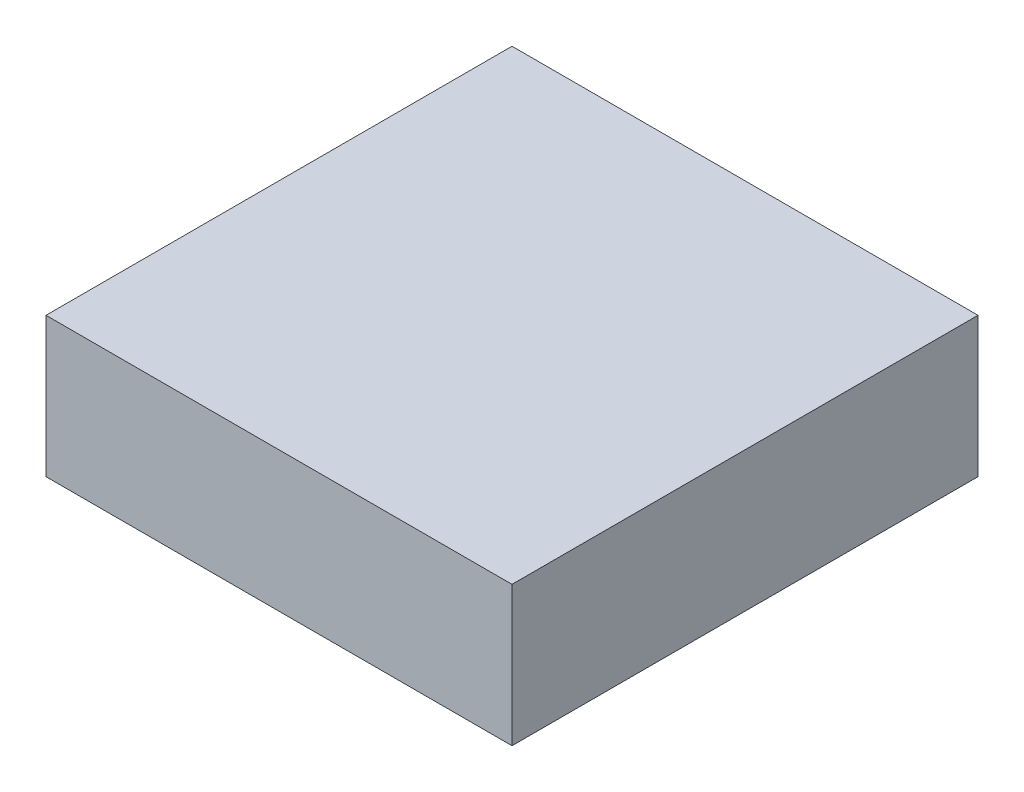
ISO-10303-21;
HEADER;
FILE_DESCRIPTION(('STEP AP214'),'2;1');
FILE_NAME('part.step','',(''),(''),'','','');
FILE_SCHEMA(('AUTOMOTIVE_DESIGN { 1 0 10303 214 1 1 1 1 }'));
ENDSEC;
DATA;
#1=APPLICATION_CONTEXT('core data for automotive mechanical design processes');
#2=APPLICATION_PROTOCOL_DEFINITION('international standard','automotive_design',2000,#1);
#3=PRODUCT_CONTEXT('',#1,'mechanical');
#4=PRODUCT('Part','Part','',(#3));
#5=PRODUCT_RELATED_PRODUCT_CATEGORY('part','',(#4));
#6=PRODUCT_DEFINITION_FORMATION('','',#4);
#7=PRODUCT_DEFINITION_CONTEXT('part definition',#1,'design');
#8=PRODUCT_DEFINITION('design','',#6,#7);
#9=PRODUCT_DEFINITION_SHAPE('','',#8);
#10=(LENGTH_UNIT() NAMED_UNIT(*) SI_UNIT(.MILLI.,.METRE.));
#11=(NAMED_UNIT(*) PLANE_ANGLE_UNIT() SI_UNIT($,.RADIAN.));
#12=(NAMED_UNIT(*) SI_UNIT($,.STERADIAN.) SOLID_ANGLE_UNIT());
#13=UNCERTAINTY_MEASURE_WITH_UNIT(LENGTH_MEASURE(1.E-05),#10,'distance_accuracy_value','');
#14=(GEOMETRIC_REPRESENTATION_CONTEXT(3) GLOBAL_UNCERTAINTY_ASSIGNED_CONTEXT((#13)) GLOBAL_UNIT_ASSIGNED_CONTEXT((#10,
#11,#12)) REPRESENTATION_CONTEXT('',''));
#15=CARTESIAN_POINT('',(0.,0.,0.));
#16=DIRECTION('',(0.,0.,1.));
#17=DIRECTION('',(1.,0.,0.));
#18=AXIS2_PLACEMENT_3D('',#15,#16,#17);
#19=CARTESIAN_POINT('',(0.,1.,0.));
#20=DIRECTION('',(0.,-1.,0.));
#21=DIRECTION('',(0.,0.,-1.));
#22=AXIS2_PLACEMENT_3D('',#19,#20,#21);
#23=TOROIDAL_SURFACE('',#22,15.,1.);
#24=CARTESIAN_POINT('',(0.,1.55644161228551,0.));
#25=DIRECTION('',(0.,-1.,0.));
#26=DIRECTION('',(0.,0.,-1.));
#27=AXIS2_PLACEMENT_3D('',#24,#25,#26);
#28=CIRCLE('',#27,15.8308867143703);
#29=CARTESIAN_POINT('',(0.,1.55644161228551,-15.8308867143703));
#30=VERTEX_POINT('',#29);
#31=EDGE_CURVE('E120',#30,#30,#28,.T.);
#32=ORIENTED_EDGE('',*,*,#31,.F.);
#33=EDGE_LOOP('',(#32));
#34=FACE_BOUND('',#33,.T.);
#35=CARTESIAN_POINT('',(0.,1.,0.));
#36=DIRECTION('',(0.,1.,0.));
#37=DIRECTION('',(0.,0.,1.));
#38=AXIS2_PLACEMENT_3D('',#35,#36,#37);
#39=CIRCLE('',#38,16.);
#40=CARTESIAN_POINT('',(0.,1.,16.));
#41=VERTEX_POINT('',#40);
#42=EDGE_CURVE('E87',#41,#41,#39,.F.);
#43=ORIENTED_EDGE('',*,*,#42,.T.);
#44=EDGE_LOOP('',(#43));
#45=FACE_BOUND('',#44,.T.);
#46=ADVANCED_FACE('F39',(#34,#45),#23,.F.);
#47=CARTESIAN_POINT('',(0.,0.,0.));
#48=DIRECTION('',(0.,-1.,0.));
#49=DIRECTION('',(0.,0.,-1.));
#50=AXIS2_PLACEMENT_3D('',#47,#48,#49);
#51=CYLINDRICAL_SURFACE('',#50,4.);
#52=CARTESIAN_POINT('',(0.,0.,0.));
#53=DIRECTION('',(0.,-1.,0.));
#54=DIRECTION('',(0.,0.,-1.));
#55=AXIS2_PLACEMENT_3D('',#52,#53,#54);
#56=CIRCLE('',#55,4.);
#57=CARTESIAN_POINT('',(0.,0.,-4.));
#58=VERTEX_POINT('',#57);
#59=EDGE_CURVE('E132',#58,#58,#56,.T.);
#60=ORIENTED_EDGE('',*,*,#59,.F.);
#61=EDGE_LOOP('',(#60));
#62=FACE_BOUND('',#61,.T.);
#63=CARTESIAN_POINT('',(0.,10.,0.));
#64=DIRECTION('',(0.,-1.,0.));
#65=DIRECTION('',(0.,0.,-1.));
#66=AXIS2_PLACEMENT_3D('',#63,#64,#65);
#67=CIRCLE('',#66,4.);
#68=CARTESIAN_POINT('',(0.,10.,-4.));
#69=VERTEX_POINT('',#68);
#70=EDGE_CURVE('E129',#69,#69,#67,.T.);
#71=ORIENTED_EDGE('',*,*,#70,.T.);
#72=EDGE_LOOP('',(#71));
#73=FACE_BOUND('',#72,.T.);
#74=ADVANCED_FACE('F151',(#62,#73),#51,.T.);
#75=CARTESIAN_POINT('',(4.,10.,0.));
#76=DIRECTION('',(0.,1.,0.));
#77=DIRECTION('',(0.,0.,1.));
#78=AXIS2_PLACEMENT_3D('',#75,#76,#77);
#79=PLANE('',#78);
#80=ORIENTED_EDGE('',*,*,#70,.F.);
#81=EDGE_LOOP('',(#80));
#82=FACE_BOUND('',#81,.T.);
#83=CARTESIAN_POINT('',(0.,10.,0.));
#84=DIRECTION('',(0.,-1.,0.));
#85=DIRECTION('',(0.,0.,-1.));
#86=AXIS2_PLACEMENT_3D('',#83,#84,#85);
#87=CIRCLE('',#86,9.);
#88=CARTESIAN_POINT('',(0.,10.,-9.));
#89=VERTEX_POINT('',#88);
#90=EDGE_CURVE('E126',#89,#89,#87,.T.);
#91=ORIENTED_EDGE('',*,*,#90,.T.);
#92=EDGE_LOOP('',(#91));
#93=FACE_BOUND('',#92,.T.);
#94=ADVANCED_FACE('F157',(#82,#93),#79,.F.);
#95=CARTESIAN_POINT('',(0.,7.79657920417591,0.));
#96=DIRECTION('',(0.,-1.,0.));
#97=DIRECTION('',(0.,0.,-1.));
#98=AXIS2_PLACEMENT_3D('',#95,#96,#97);
#99=TOROIDAL_SURFACE('',#98,9.,2.20342079582409);
#100=ORIENTED_EDGE('',*,*,#90,.F.);
#101=EDGE_LOOP('',(#100));
#102=FACE_BOUND('',#101,.T.);
#103=CARTESIAN_POINT('',(0.,9.02265422434769,0.));
#104=DIRECTION('',(0.,-1.,0.));
#105=DIRECTION('',(0.,0.,-1.));
#106=AXIS2_PLACEMENT_3D('',#103,#104,#105);
#107=CIRCLE('',#106,10.8307930654175);
#108=CARTESIAN_POINT('',(0.,9.02265422434769,-10.8307930654175));
#109=VERTEX_POINT('',#108);
#110=EDGE_CURVE('E123',#109,#109,#107,.T.);
#111=ORIENTED_EDGE('',*,*,#110,.T.);
#112=EDGE_LOOP('',(#111));
#113=FACE_BOUND('',#112,.T.);
#114=ADVANCED_FACE('F166',(#102,#113),#99,.F.);
#115=CARTESIAN_POINT('',(0.,1.55644161228551,0.));
#116=DIRECTION('',(0.,-1.,0.));
#117=DIRECTION('',(0.,0.,-1.));
#118=AXIS2_PLACEMENT_3D('',#115,#116,#117);
#119=CONICAL_SURFACE('',#118,15.8308867143703,0.590096988860552);
#120=ORIENTED_EDGE('',*,*,#110,.F.);
#121=EDGE_LOOP('',(#120));
#122=FACE_BOUND('',#121,.T.);
#123=ORIENTED_EDGE('',*,*,#31,.T.);
#124=EDGE_LOOP('',(#123));
#125=FACE_BOUND('',#124,.T.);
#126=ADVANCED_FACE('F163',(#122,#125),#119,.F.);
#127=CARTESIAN_POINT('',(0.,0.,0.));
#128=DIRECTION('',(0.,-1.,0.));
#129=DIRECTION('',(0.,0.,-1.));
#130=AXIS2_PLACEMENT_3D('',#127,#128,#129);
#131=PLANE('',#130);
#132=ORIENTED_EDGE('',*,*,#59,.T.);
#133=EDGE_LOOP('',(#132));
#134=FACE_BOUND('',#133,.T.);
#135=ADVANCED_FACE('F145',(#134),#131,.T.);
#136=CARTESIAN_POINT('',(0.,1.,0.));
#137=DIRECTION('',(0.,1.,0.));
#138=DIRECTION('',(0.,0.,1.));
#139=AXIS2_PLACEMENT_3D('',#136,#137,#138);
#140=PLANE('',#139);
#141=CARTESIAN_POINT('',(15.0000000000002,1.,-14.9999999999998));
#142=DIRECTION('',(0.,-1.,0.));
#143=DIRECTION('',(-1.,0.,0.));
#144=AXIS2_PLACEMENT_3D('',#141,#142,#143);
#145=CIRCLE('',#144,2.75);
#146=CARTESIAN_POINT('',(12.2500000000002,1.,-14.9999999999999));
#147=VERTEX_POINT('',#146);
#148=EDGE_CURVE('E298',#147,#147,#145,.T.);
#149=ORIENTED_EDGE('',*,*,#148,.F.);
#150=EDGE_LOOP('',(#149));
#151=FACE_BOUND('',#150,.T.);
#152=CARTESIAN_POINT('',(-15.,1.,-15.));
#153=DIRECTION('',(0.,-1.,0.));
#154=DIRECTION('',(0.,0.,1.));
#155=AXIS2_PLACEMENT_3D('',#152,#153,#154);
#156=CIRCLE('',#155,2.75);
#157=CARTESIAN_POINT('',(-15.,1.,-12.25));
#158=VERTEX_POINT('',#157);
#159=EDGE_CURVE('E300',#158,#158,#156,.T.);
#160=ORIENTED_EDGE('',*,*,#159,.F.);
#161=EDGE_LOOP('',(#160));
#162=FACE_BOUND('',#161,.T.);
#163=CARTESIAN_POINT('',(-15.0000000000001,1.,14.9999999999999));
#164=DIRECTION('',(0.,-1.,0.));
#165=DIRECTION('',(1.,0.,0.));
#166=AXIS2_PLACEMENT_3D('',#163,#164,#165);
#167=CIRCLE('',#166,2.75);
#168=CARTESIAN_POINT('',(-12.2500000000001,1.,15.));
#169=VERTEX_POINT('',#168);
#170=EDGE_CURVE('E308',#169,#169,#167,.T.);
#171=ORIENTED_EDGE('',*,*,#170,.F.);
#172=EDGE_LOOP('',(#171));
#173=FACE_BOUND('',#172,.T.);
#174=CARTESIAN_POINT('',(15.,1.,15.));
#175=DIRECTION('',(0.,-1.,0.));
#176=DIRECTION('',(0.,0.,-1.));
#177=AXIS2_PLACEMENT_3D('',#174,#175,#176);
#178=CIRCLE('',#177,2.75);
#179=CARTESIAN_POINT('',(15.,1.,12.25));
#180=VERTEX_POINT('',#179);
#181=EDGE_CURVE('E116',#180,#180,#178,.T.);
#182=ORIENTED_EDGE('',*,*,#181,.F.);
#183=EDGE_LOOP('',(#182));
#184=FACE_BOUND('',#183,.T.);
#185=DIRECTION('',(1.,0.,0.));
#186=VECTOR('',#185,1.);
#187=CARTESIAN_POINT('',(-20.,1.,-20.));
#188=LINE('',#187,#186);
#189=CARTESIAN_POINT('',(-20.,1.,-20.));
#190=VERTEX_POINT('',#189);
#191=CARTESIAN_POINT('',(20.,1.,-20.));
#192=VERTEX_POINT('',#191);
#193=EDGE_CURVE('E54',#190,#192,#188,.T.);
#194=ORIENTED_EDGE('',*,*,#193,.T.);
#195=DIRECTION('',(0.,0.,1.));
#196=VECTOR('',#195,1.);
#197=CARTESIAN_POINT('',(20.,1.,-20.));
#198=LINE('',#197,#196);
#199=CARTESIAN_POINT('',(20.,1.,20.));
#200=VERTEX_POINT('',#199);
#201=EDGE_CURVE('E78',#192,#200,#198,.T.);
#202=ORIENTED_EDGE('',*,*,#201,.T.);
#203=DIRECTION('',(-1.,0.,0.));
#204=VECTOR('',#203,1.);
#205=CARTESIAN_POINT('',(20.,1.,20.));
#206=LINE('',#205,#204);
#207=CARTESIAN_POINT('',(-20.,1.,20.));
#208=VERTEX_POINT('',#207);
#209=EDGE_CURVE('E82',#200,#208,#206,.T.);
#210=ORIENTED_EDGE('',*,*,#209,.T.);
#211=DIRECTION('',(0.,0.,-1.));
#212=VECTOR('',#211,1.);
#213=CARTESIAN_POINT('',(-20.,1.,20.));
#214=LINE('',#213,#212);
#215=EDGE_CURVE('E96',#208,#190,#214,.T.);
#216=ORIENTED_EDGE('',*,*,#215,.T.);
#217=EDGE_LOOP('',(#194,#202,#210,#216));
#218=FACE_BOUND('',#217,.T.);
#219=ORIENTED_EDGE('',*,*,#42,.F.);
#220=EDGE_LOOP('',(#219));
#221=FACE_BOUND('',#220,.T.);
#222=ADVANCED_FACE('F80',(#151,#162,#173,#184,#218,#221),#140,.F.);
#223=CARTESIAN_POINT('',(0.,13.,0.));
#224=DIRECTION('',(0.,-1.,0.));
#225=DIRECTION('',(0.,0.,-1.));
#226=AXIS2_PLACEMENT_3D('',#223,#224,#225);
#227=PLANE('',#226);
#228=DIRECTION('',(0.,0.,-1.));
#229=VECTOR('',#228,1.);
#230=CARTESIAN_POINT('',(20.,13.,20.));
#231=LINE('',#230,#229);
#232=CARTESIAN_POINT('',(20.,13.,20.));
#233=VERTEX_POINT('',#232);
#234=CARTESIAN_POINT('',(20.,13.,-20.));
#235=VERTEX_POINT('',#234);
#236=EDGE_CURVE('E98',#233,#235,#231,.T.);
#237=ORIENTED_EDGE('',*,*,#236,.T.);
#238=DIRECTION('',(-1.,0.,0.));
#239=VECTOR('',#238,1.);
#240=CARTESIAN_POINT('',(-20.,13.,-20.));
#241=LINE('',#240,#239);
#242=CARTESIAN_POINT('',(-20.,13.,-20.));
#243=VERTEX_POINT('',#242);
#244=EDGE_CURVE('E111',#235,#243,#241,.T.);
#245=ORIENTED_EDGE('',*,*,#244,.T.);
#246=DIRECTION('',(0.,0.,1.));
#247=VECTOR('',#246,1.);
#248=CARTESIAN_POINT('',(-20.,13.,20.));
#249=LINE('',#248,#247);
#250=CARTESIAN_POINT('',(-20.,13.,20.));
#251=VERTEX_POINT('',#250);
#252=EDGE_CURVE('E101',#243,#251,#249,.T.);
#253=ORIENTED_EDGE('',*,*,#252,.T.);
#254=DIRECTION('',(1.,0.,0.));
#255=VECTOR('',#254,1.);
#256=CARTESIAN_POINT('',(-20.,13.,20.));
#257=LINE('',#256,#255);
#258=EDGE_CURVE('E62',#251,#233,#257,.T.);
#259=ORIENTED_EDGE('',*,*,#258,.T.);
#260=EDGE_LOOP('',(#237,#245,#253,#259));
#261=FACE_BOUND('',#260,.T.);
#262=ADVANCED_FACE('F136',(#261),#227,.F.);
#263=CARTESIAN_POINT('',(20.,13.,20.));
#264=DIRECTION('',(-1.,0.,0.));
#265=DIRECTION('',(0.,0.,1.));
#266=AXIS2_PLACEMENT_3D('',#263,#264,#265);
#267=PLANE('',#266);
#268=DIRECTION('',(0.,-1.,0.));
#269=VECTOR('',#268,1.);
#270=CARTESIAN_POINT('',(20.,13.,20.));
#271=LINE('',#270,#269);
#272=EDGE_CURVE('E92',#233,#200,#271,.T.);
#273=ORIENTED_EDGE('',*,*,#272,.T.);
#274=ORIENTED_EDGE('',*,*,#201,.F.);
#275=DIRECTION('',(0.,-1.,0.));
#276=VECTOR('',#275,1.);
#277=CARTESIAN_POINT('',(20.,13.,-20.));
#278=LINE('',#277,#276);
#279=EDGE_CURVE('E11',#235,#192,#278,.T.);
#280=ORIENTED_EDGE('',*,*,#279,.F.);
#281=ORIENTED_EDGE('',*,*,#236,.F.);
#282=EDGE_LOOP('',(#273,#274,#280,#281));
#283=FACE_BOUND('',#282,.T.);
#284=ADVANCED_FACE('F41',(#283),#267,.F.);
#285=CARTESIAN_POINT('',(-20.,13.,20.));
#286=DIRECTION('',(0.,0.,-1.));
#287=DIRECTION('',(-1.,0.,0.));
#288=AXIS2_PLACEMENT_3D('',#285,#286,#287);
#289=PLANE('',#288);
#290=DIRECTION('',(0.,-1.,0.));
#291=VECTOR('',#290,1.);
#292=CARTESIAN_POINT('',(-20.,13.,20.));
#293=LINE('',#292,#291);
#294=EDGE_CURVE('E95',#251,#208,#293,.T.);
#295=ORIENTED_EDGE('',*,*,#294,.T.);
#296=ORIENTED_EDGE('',*,*,#209,.F.);
#297=ORIENTED_EDGE('',*,*,#272,.F.);
#298=ORIENTED_EDGE('',*,*,#258,.F.);
#299=EDGE_LOOP('',(#295,#296,#297,#298));
#300=FACE_BOUND('',#299,.T.);
#301=ADVANCED_FACE('F91',(#300),#289,.F.);
#302=CARTESIAN_POINT('',(-20.,13.,20.));
#303=DIRECTION('',(1.,0.,0.));
#304=DIRECTION('',(0.,0.,-1.));
#305=AXIS2_PLACEMENT_3D('',#302,#303,#304);
#306=PLANE('',#305);
#307=DIRECTION('',(0.,-1.,0.));
#308=VECTOR('',#307,1.);
#309=CARTESIAN_POINT('',(-20.,13.,-20.));
#310=LINE('',#309,#308);
#311=EDGE_CURVE('E47',#243,#190,#310,.T.);
#312=ORIENTED_EDGE('',*,*,#311,.T.);
#313=ORIENTED_EDGE('',*,*,#215,.F.);
#314=ORIENTED_EDGE('',*,*,#294,.F.);
#315=ORIENTED_EDGE('',*,*,#252,.F.);
#316=EDGE_LOOP('',(#312,#313,#314,#315));
#317=FACE_BOUND('',#316,.T.);
#318=ADVANCED_FACE('F108',(#317),#306,.F.);
#319=CARTESIAN_POINT('',(-20.,13.,-20.));
#320=DIRECTION('',(0.,0.,1.));
#321=DIRECTION('',(1.,0.,0.));
#322=AXIS2_PLACEMENT_3D('',#319,#320,#321);
#323=PLANE('',#322);
#324=ORIENTED_EDGE('',*,*,#279,.T.);
#325=ORIENTED_EDGE('',*,*,#193,.F.);
#326=ORIENTED_EDGE('',*,*,#311,.F.);
#327=ORIENTED_EDGE('',*,*,#244,.F.);
#328=EDGE_LOOP('',(#324,#325,#326,#327));
#329=FACE_BOUND('',#328,.T.);
#330=ADVANCED_FACE('F110',(#329),#323,.F.);
#331=CARTESIAN_POINT('',(15.,3.75,15.));
#332=DIRECTION('',(0.,-1.,0.));
#333=DIRECTION('',(1.,0.,0.));
#334=AXIS2_PLACEMENT_3D('',#331,#332,#333);
#335=SPHERICAL_SURFACE('',#334,2.75);
#336=CARTESIAN_POINT('',(15.,3.75,15.));
#337=DIRECTION('',(0.,-1.,0.));
#338=DIRECTION('',(0.,0.,-1.));
#339=AXIS2_PLACEMENT_3D('',#336,#337,#338);
#340=CIRCLE('',#339,2.75);
#341=CARTESIAN_POINT('',(15.,3.75,12.25));
#342=VERTEX_POINT('',#341);
#343=EDGE_CURVE('E112',#342,#342,#340,.T.);
#344=ORIENTED_EDGE('',*,*,#343,.T.);
#345=EDGE_LOOP('',(#344));
#346=FACE_BOUND('',#345,.T.);
#347=ADVANCED_FACE('F214',(#346),#335,.F.);
#348=CARTESIAN_POINT('',(15.,-6.64755138198264,15.));
#349=DIRECTION('',(0.,-1.,0.));
#350=DIRECTION('',(0.,0.,-1.));
#351=AXIS2_PLACEMENT_3D('',#348,#349,#350);
#352=CYLINDRICAL_SURFACE('',#351,2.75);
#353=ORIENTED_EDGE('',*,*,#343,.F.);
#354=EDGE_LOOP('',(#353));
#355=FACE_BOUND('',#354,.T.);
#356=ORIENTED_EDGE('',*,*,#181,.T.);
#357=EDGE_LOOP('',(#356));
#358=FACE_BOUND('',#357,.T.);
#359=ADVANCED_FACE('F219',(#355,#358),#352,.F.);
#360=CARTESIAN_POINT('',(-15.0000000000001,3.75,14.9999999999999));
#361=DIRECTION('',(0.,-1.,0.));
#362=DIRECTION('',(0.,0.,1.));
#363=AXIS2_PLACEMENT_3D('',#360,#361,#362);
#364=SPHERICAL_SURFACE('',#363,2.75);
#365=CARTESIAN_POINT('',(-15.0000000000001,3.75,14.9999999999999));
#366=DIRECTION('',(0.,-1.,0.));
#367=DIRECTION('',(1.,0.,0.));
#368=AXIS2_PLACEMENT_3D('',#365,#366,#367);
#369=CIRCLE('',#368,2.75);
#370=CARTESIAN_POINT('',(-12.2500000000001,3.75,15.));
#371=VERTEX_POINT('',#370);
#372=EDGE_CURVE('E311',#371,#371,#369,.T.);
#373=ORIENTED_EDGE('',*,*,#372,.T.);
#374=EDGE_LOOP('',(#373));
#375=FACE_BOUND('',#374,.T.);
#376=ADVANCED_FACE('F228',(#375),#364,.F.);
#377=CARTESIAN_POINT('',(-15.0000000000001,-6.64755138198264,14.9999999999999));
#378=DIRECTION('',(0.,-1.,0.));
#379=DIRECTION('',(1.,0.,0.));
#380=AXIS2_PLACEMENT_3D('',#377,#378,#379);
#381=CYLINDRICAL_SURFACE('',#380,2.75);
#382=ORIENTED_EDGE('',*,*,#372,.F.);
#383=EDGE_LOOP('',(#382));
#384=FACE_BOUND('',#383,.T.);
#385=ORIENTED_EDGE('',*,*,#170,.T.);
#386=EDGE_LOOP('',(#385));
#387=FACE_BOUND('',#386,.T.);
#388=ADVANCED_FACE('F237',(#384,#387),#381,.F.);
#389=CARTESIAN_POINT('',(-15.,3.75,-15.));
#390=DIRECTION('',(0.,-1.,0.));
#391=DIRECTION('',(-1.,0.,0.));
#392=AXIS2_PLACEMENT_3D('',#389,#390,#391);
#393=SPHERICAL_SURFACE('',#392,2.75);
#394=CARTESIAN_POINT('',(-15.,3.75,-15.));
#395=DIRECTION('',(0.,-1.,0.));
#396=DIRECTION('',(0.,0.,1.));
#397=AXIS2_PLACEMENT_3D('',#394,#395,#396);
#398=CIRCLE('',#397,2.75);
#399=CARTESIAN_POINT('',(-15.,3.75,-12.25));
#400=VERTEX_POINT('',#399);
#401=EDGE_CURVE('E305',#400,#400,#398,.T.);
#402=ORIENTED_EDGE('',*,*,#401,.T.);
#403=EDGE_LOOP('',(#402));
#404=FACE_BOUND('',#403,.T.);
#405=ADVANCED_FACE('F246',(#404),#393,.F.);
#406=CARTESIAN_POINT('',(-15.,-6.64755138198264,-15.));
#407=DIRECTION('',(0.,-1.,0.));
#408=DIRECTION('',(0.,0.,1.));
#409=AXIS2_PLACEMENT_3D('',#406,#407,#408);
#410=CYLINDRICAL_SURFACE('',#409,2.75);
#411=ORIENTED_EDGE('',*,*,#401,.F.);
#412=EDGE_LOOP('',(#411));
#413=FACE_BOUND('',#412,.T.);
#414=ORIENTED_EDGE('',*,*,#159,.T.);
#415=EDGE_LOOP('',(#414));
#416=FACE_BOUND('',#415,.T.);
#417=ADVANCED_FACE('F255',(#413,#416),#410,.F.);
#418=CARTESIAN_POINT('',(15.0000000000002,3.75,-14.9999999999998));
#419=DIRECTION('',(0.,-1.,0.));
#420=DIRECTION('',(0.,0.,-1.));
#421=AXIS2_PLACEMENT_3D('',#418,#419,#420);
#422=SPHERICAL_SURFACE('',#421,2.75);
#423=CARTESIAN_POINT('',(15.0000000000002,3.75,-14.9999999999998));
#424=DIRECTION('',(0.,-1.,0.));
#425=DIRECTION('',(-1.,0.,0.));
#426=AXIS2_PLACEMENT_3D('',#423,#424,#425);
#427=CIRCLE('',#426,2.75);
#428=CARTESIAN_POINT('',(12.2500000000002,3.75,-14.9999999999999));
#429=VERTEX_POINT('',#428);
#430=EDGE_CURVE('E295',#429,#429,#427,.T.);
#431=ORIENTED_EDGE('',*,*,#430,.T.);
#432=EDGE_LOOP('',(#431));
#433=FACE_BOUND('',#432,.T.);
#434=ADVANCED_FACE('F264',(#433),#422,.F.);
#435=CARTESIAN_POINT('',(15.0000000000002,-6.64755138198264,-14.9999999999998));
#436=DIRECTION('',(0.,-1.,0.));
#437=DIRECTION('',(-1.,0.,0.));
#438=AXIS2_PLACEMENT_3D('',#435,#436,#437);
#439=CYLINDRICAL_SURFACE('',#438,2.75);
#440=ORIENTED_EDGE('',*,*,#430,.F.);
#441=EDGE_LOOP('',(#440));
#442=FACE_BOUND('',#441,.T.);
#443=ORIENTED_EDGE('',*,*,#148,.T.);
#444=EDGE_LOOP('',(#443));
#445=FACE_BOUND('',#444,.T.);
#446=ADVANCED_FACE('F273',(#442,#445),#439,.F.);
#447=CLOSED_SHELL('',(#46,#74,#94,#114,#126,#135,#222,#262,#284,#301,#318,#330,#347,#359,#376,
#388,#405,#417,#434,#446));
#448=MANIFOLD_SOLID_BREP('B2',#447);
#449=ADVANCED_BREP_SHAPE_REPRESENTATION('',(#18,#448),#14);
#450=SHAPE_DEFINITION_REPRESENTATION(#9,#449);
ENDSEC;
END-ISO-10303-21;
